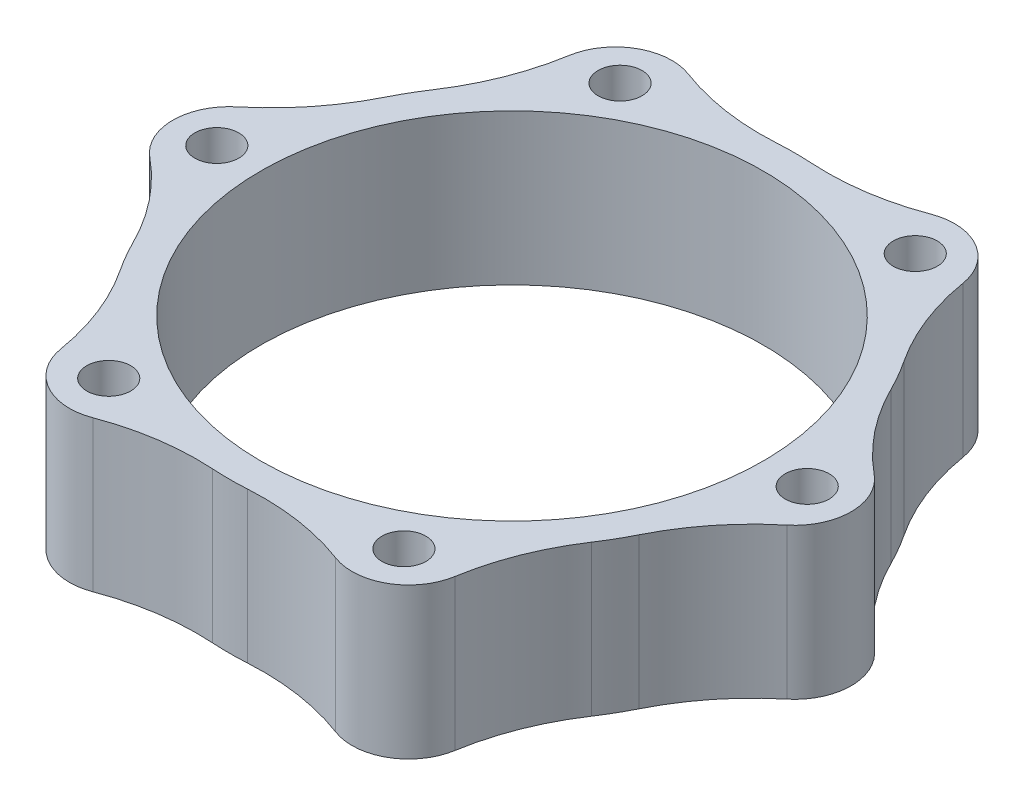
ISO-10303-21;
HEADER;
FILE_DESCRIPTION(('STEP AP214'),'2;1');
FILE_NAME('part.step','',(''),(''),'','','');
FILE_SCHEMA(('AUTOMOTIVE_DESIGN { 1 0 10303 214 1 1 1 1 }'));
ENDSEC;
DATA;
#1=APPLICATION_CONTEXT('core data for automotive mechanical design processes');
#2=APPLICATION_PROTOCOL_DEFINITION('international standard','automotive_design',2000,#1);
#3=PRODUCT_CONTEXT('',#1,'mechanical');
#4=PRODUCT('Part','Part','',(#3));
#5=PRODUCT_RELATED_PRODUCT_CATEGORY('part','',(#4));
#6=PRODUCT_DEFINITION_FORMATION('','',#4);
#7=PRODUCT_DEFINITION_CONTEXT('part definition',#1,'design');
#8=PRODUCT_DEFINITION('design','',#6,#7);
#9=PRODUCT_DEFINITION_SHAPE('','',#8);
#10=(LENGTH_UNIT() NAMED_UNIT(*) SI_UNIT(.MILLI.,.METRE.));
#11=(NAMED_UNIT(*) PLANE_ANGLE_UNIT() SI_UNIT($,.RADIAN.));
#12=(NAMED_UNIT(*) SI_UNIT($,.STERADIAN.) SOLID_ANGLE_UNIT());
#13=UNCERTAINTY_MEASURE_WITH_UNIT(LENGTH_MEASURE(1.E-05),#10,'distance_accuracy_value','');
#14=(GEOMETRIC_REPRESENTATION_CONTEXT(3) GLOBAL_UNCERTAINTY_ASSIGNED_CONTEXT((#13)) GLOBAL_UNIT_ASSIGNED_CONTEXT((#10,
#11,#12)) REPRESENTATION_CONTEXT('',''));
#15=CARTESIAN_POINT('',(0.,0.,0.));
#16=DIRECTION('',(0.,0.,1.));
#17=DIRECTION('',(1.,0.,0.));
#18=AXIS2_PLACEMENT_3D('',#15,#16,#17);
#19=CARTESIAN_POINT('',(0.,96.0623050896224,0.));
#20=DIRECTION('',(0.,-1.,0.));
#21=DIRECTION('',(0.,0.,-1.));
#22=AXIS2_PLACEMENT_3D('',#19,#20,#21);
#23=CYLINDRICAL_SURFACE('',#22,28.575);
#24=CARTESIAN_POINT('',(0.,0.,0.));
#25=DIRECTION('',(0.,1.,0.));
#26=DIRECTION('',(0.,0.,1.));
#27=AXIS2_PLACEMENT_3D('',#24,#25,#26);
#28=CIRCLE('',#27,28.575);
#29=CARTESIAN_POINT('',(1.76747627445477,0.,-28.5202849322941));
#30=VERTEX_POINT('',#29);
#31=CARTESIAN_POINT('',(-1.76747627445538,0.,-28.520284932294));
#32=VERTEX_POINT('',#31);
#33=EDGE_CURVE('E405',#30,#32,#28,.T.);
#34=ORIENTED_EDGE('',*,*,#33,.T.);
#35=DIRECTION('',(0.,-1.,0.));
#36=VECTOR('',#35,1.);
#37=CARTESIAN_POINT('',(-1.76747627445538,96.0623050896224,-28.520284932294));
#38=LINE('',#37,#36);
#39=CARTESIAN_POINT('',(-1.76747627445538,15.24,-28.520284932294));
#40=VERTEX_POINT('',#39);
#41=EDGE_CURVE('E308',#32,#40,#38,.F.);
#42=ORIENTED_EDGE('',*,*,#41,.T.);
#43=CARTESIAN_POINT('',(0.,15.24,0.));
#44=DIRECTION('',(0.,1.,0.));
#45=DIRECTION('',(0.,0.,1.));
#46=AXIS2_PLACEMENT_3D('',#43,#44,#45);
#47=CIRCLE('',#46,28.575);
#48=CARTESIAN_POINT('',(1.76747627445477,15.24,-28.5202849322941));
#49=VERTEX_POINT('',#48);
#50=EDGE_CURVE('E449',#49,#40,#47,.T.);
#51=ORIENTED_EDGE('',*,*,#50,.F.);
#52=DIRECTION('',(0.,-1.,0.));
#53=VECTOR('',#52,1.);
#54=CARTESIAN_POINT('',(1.76747627445477,96.0623050896224,-28.5202849322941));
#55=LINE('',#54,#53);
#56=EDGE_CURVE('E298',#49,#30,#55,.T.);
#57=ORIENTED_EDGE('',*,*,#56,.T.);
#58=EDGE_LOOP('',(#34,#42,#51,#57));
#59=FACE_BOUND('',#58,.T.);
#60=ADVANCED_FACE('F41',(#59),#23,.T.);
#61=CARTESIAN_POINT('',(25.5830294117647,0.,-12.7294631118827));
#62=VERTEX_POINT('',#61);
#63=CARTESIAN_POINT('',(23.8155531373095,0.,-15.7908218204116));
#64=VERTEX_POINT('',#63);
#65=EDGE_CURVE('E407',#62,#64,#28,.T.);
#66=ORIENTED_EDGE('',*,*,#65,.T.);
#67=DIRECTION('',(0.,-1.,0.));
#68=VECTOR('',#67,1.);
#69=CARTESIAN_POINT('',(23.8155531373095,96.0623050896224,-15.7908218204116));
#70=LINE('',#69,#68);
#71=CARTESIAN_POINT('',(23.8155531373095,15.24,-15.7908218204116));
#72=VERTEX_POINT('',#71);
#73=EDGE_CURVE('E290',#64,#72,#70,.F.);
#74=ORIENTED_EDGE('',*,*,#73,.T.);
#75=CARTESIAN_POINT('',(25.5830294117647,15.24,-12.7294631118827));
#76=VERTEX_POINT('',#75);
#77=EDGE_CURVE('E447',#76,#72,#47,.T.);
#78=ORIENTED_EDGE('',*,*,#77,.F.);
#79=DIRECTION('',(0.,-1.,0.));
#80=VECTOR('',#79,1.);
#81=CARTESIAN_POINT('',(25.5830294117647,96.0623050896224,-12.7294631118827));
#82=LINE('',#81,#80);
#83=EDGE_CURVE('E280',#76,#62,#82,.T.);
#84=ORIENTED_EDGE('',*,*,#83,.T.);
#85=EDGE_LOOP('',(#66,#74,#78,#84));
#86=FACE_BOUND('',#85,.T.);
#87=ADVANCED_FACE('F469',(#86),#23,.T.);
#88=CARTESIAN_POINT('',(23.8155531373097,0.,15.7908218204112));
#89=VERTEX_POINT('',#88);
#90=CARTESIAN_POINT('',(25.5830294117647,0.,12.7294631118827));
#91=VERTEX_POINT('',#90);
#92=EDGE_CURVE('E412',#89,#91,#28,.T.);
#93=ORIENTED_EDGE('',*,*,#92,.T.);
#94=DIRECTION('',(0.,-1.,0.));
#95=VECTOR('',#94,1.);
#96=CARTESIAN_POINT('',(25.5830294117647,96.0623050896224,12.7294631118827));
#97=LINE('',#96,#95);
#98=CARTESIAN_POINT('',(25.5830294117647,15.24,12.7294631118827));
#99=VERTEX_POINT('',#98);
#100=EDGE_CURVE('E272',#91,#99,#97,.F.);
#101=ORIENTED_EDGE('',*,*,#100,.T.);
#102=CARTESIAN_POINT('',(23.8155531373097,15.24,15.7908218204112));
#103=VERTEX_POINT('',#102);
#104=EDGE_CURVE('E445',#103,#99,#47,.T.);
#105=ORIENTED_EDGE('',*,*,#104,.F.);
#106=DIRECTION('',(0.,-1.,0.));
#107=VECTOR('',#106,1.);
#108=CARTESIAN_POINT('',(23.8155531373098,96.0623050896224,15.7908218204112));
#109=LINE('',#108,#107);
#110=EDGE_CURVE('E262',#103,#89,#109,.T.);
#111=ORIENTED_EDGE('',*,*,#110,.T.);
#112=EDGE_LOOP('',(#93,#101,#105,#111));
#113=FACE_BOUND('',#112,.T.);
#114=ADVANCED_FACE('F446',(#113),#23,.T.);
#115=CARTESIAN_POINT('',(-1.76747627445497,0.,28.520284932294));
#116=VERTEX_POINT('',#115);
#117=CARTESIAN_POINT('',(1.76747627445517,0.,28.520284932294));
#118=VERTEX_POINT('',#117);
#119=EDGE_CURVE('E225',#116,#118,#28,.T.);
#120=ORIENTED_EDGE('',*,*,#119,.T.);
#121=DIRECTION('',(0.,-1.,0.));
#122=VECTOR('',#121,1.);
#123=CARTESIAN_POINT('',(1.76747627445517,96.0623050896224,28.520284932294));
#124=LINE('',#123,#122);
#125=CARTESIAN_POINT('',(1.76747627445517,15.24,28.520284932294));
#126=VERTEX_POINT('',#125);
#127=EDGE_CURVE('E254',#118,#126,#124,.F.);
#128=ORIENTED_EDGE('',*,*,#127,.T.);
#129=CARTESIAN_POINT('',(-1.76747627445497,15.24,28.520284932294));
#130=VERTEX_POINT('',#129);
#131=EDGE_CURVE('E384',#130,#126,#47,.T.);
#132=ORIENTED_EDGE('',*,*,#131,.F.);
#133=DIRECTION('',(0.,-1.,0.));
#134=VECTOR('',#133,1.);
#135=CARTESIAN_POINT('',(-1.76747627445497,96.0623050896224,28.5202849322941));
#136=LINE('',#135,#134);
#137=EDGE_CURVE('E245',#130,#116,#136,.T.);
#138=ORIENTED_EDGE('',*,*,#137,.T.);
#139=EDGE_LOOP('',(#120,#128,#132,#138));
#140=FACE_BOUND('',#139,.T.);
#141=ADVANCED_FACE('F424',(#140),#23,.T.);
#142=CARTESIAN_POINT('',(-25.5830294117647,0.,12.7294631118827));
#143=VERTEX_POINT('',#142);
#144=CARTESIAN_POINT('',(-23.8155531373096,0.,15.7908218204114));
#145=VERTEX_POINT('',#144);
#146=EDGE_CURVE('E207',#143,#145,#28,.T.);
#147=ORIENTED_EDGE('',*,*,#146,.T.);
#148=DIRECTION('',(0.,-1.,0.));
#149=VECTOR('',#148,1.);
#150=CARTESIAN_POINT('',(-23.8155531373096,96.0623050896224,15.7908218204114));
#151=LINE('',#150,#149);
#152=CARTESIAN_POINT('',(-23.8155531373096,15.24,15.7908218204114));
#153=VERTEX_POINT('',#152);
#154=EDGE_CURVE('E232',#145,#153,#151,.F.);
#155=ORIENTED_EDGE('',*,*,#154,.T.);
#156=CARTESIAN_POINT('',(-25.5830294117647,15.24,12.7294631118827));
#157=VERTEX_POINT('',#156);
#158=EDGE_CURVE('E210',#157,#153,#47,.T.);
#159=ORIENTED_EDGE('',*,*,#158,.F.);
#160=DIRECTION('',(0.,-1.,0.));
#161=VECTOR('',#160,1.);
#162=CARTESIAN_POINT('',(-25.5830294117647,96.0623050896224,12.7294631118827));
#163=LINE('',#162,#161);
#164=EDGE_CURVE('E203',#157,#143,#163,.T.);
#165=ORIENTED_EDGE('',*,*,#164,.T.);
#166=EDGE_LOOP('',(#147,#155,#159,#165));
#167=FACE_BOUND('',#166,.T.);
#168=ADVANCED_FACE('F205',(#167),#23,.T.);
#169=CARTESIAN_POINT('',(-23.8155531373099,15.24,-15.7908218204111));
#170=VERTEX_POINT('',#169);
#171=CARTESIAN_POINT('',(-25.5830294117647,15.24,-12.7294631118827));
#172=VERTEX_POINT('',#171);
#173=EDGE_CURVE('E224',#170,#172,#47,.T.);
#174=ORIENTED_EDGE('',*,*,#173,.F.);
#175=DIRECTION('',(0.,-1.,0.));
#176=VECTOR('',#175,1.);
#177=CARTESIAN_POINT('',(-23.8155531373099,96.0623050896224,-15.7908218204111));
#178=LINE('',#177,#176);
#179=CARTESIAN_POINT('',(-23.8155531373099,0.,-15.7908218204111));
#180=VERTEX_POINT('',#179);
#181=EDGE_CURVE('E58',#170,#180,#178,.T.);
#182=ORIENTED_EDGE('',*,*,#181,.T.);
#183=CARTESIAN_POINT('',(-25.5830294117647,0.,-12.7294631118827));
#184=VERTEX_POINT('',#183);
#185=EDGE_CURVE('E227',#180,#184,#28,.T.);
#186=ORIENTED_EDGE('',*,*,#185,.T.);
#187=DIRECTION('',(0.,-1.,0.));
#188=VECTOR('',#187,1.);
#189=CARTESIAN_POINT('',(-25.5830294117647,96.0623050896224,-12.7294631118827));
#190=LINE('',#189,#188);
#191=EDGE_CURVE('E213',#184,#172,#190,.F.);
#192=ORIENTED_EDGE('',*,*,#191,.T.);
#193=EDGE_LOOP('',(#174,#182,#186,#192));
#194=FACE_BOUND('',#193,.T.);
#195=ADVANCED_FACE('F404',(#194),#23,.T.);
#196=CARTESIAN_POINT('',(0.,0.,0.));
#197=DIRECTION('',(0.,1.,0.));
#198=DIRECTION('',(0.,0.,1.));
#199=AXIS2_PLACEMENT_3D('',#196,#197,#198);
#200=PLANE('',#199);
#201=CARTESIAN_POINT('',(-14.9225000000003,0.,25.8465281759464));
#202=DIRECTION('',(0.,1.,0.));
#203=DIRECTION('',(0.866025403784433,0.,0.50000000000001));
#204=AXIS2_PLACEMENT_3D('',#201,#202,#203);
#205=CIRCLE('',#204,2.2225);
#206=CARTESIAN_POINT('',(-12.9977585400894,0.,26.9577781759464));
#207=VERTEX_POINT('',#206);
#208=EDGE_CURVE('E794',#207,#207,#205,.T.);
#209=ORIENTED_EDGE('',*,*,#208,.T.);
#210=EDGE_LOOP('',(#209));
#211=FACE_BOUND('',#210,.T.);
#212=CARTESIAN_POINT('',(14.9224999999998,0.,25.8465281759467));
#213=DIRECTION('',(0.,1.,0.));
#214=DIRECTION('',(0.866025403784443,0.,-0.499999999999992));
#215=AXIS2_PLACEMENT_3D('',#212,#213,#214);
#216=CIRCLE('',#215,2.2225);
#217=CARTESIAN_POINT('',(16.8472414599107,0.,24.7352781759467));
#218=VERTEX_POINT('',#217);
#219=EDGE_CURVE('E795',#218,#218,#216,.T.);
#220=ORIENTED_EDGE('',*,*,#219,.T.);
#221=EDGE_LOOP('',(#220));
#222=FACE_BOUND('',#221,.T.);
#223=CARTESIAN_POINT('',(29.845,0.,0.));
#224=DIRECTION('',(0.,1.,0.));
#225=DIRECTION('',(0.,0.,-1.));
#226=AXIS2_PLACEMENT_3D('',#223,#224,#225);
#227=CIRCLE('',#226,2.2225);
#228=CARTESIAN_POINT('',(29.845,0.,-2.2225));
#229=VERTEX_POINT('',#228);
#230=EDGE_CURVE('E797',#229,#229,#227,.T.);
#231=ORIENTED_EDGE('',*,*,#230,.T.);
#232=EDGE_LOOP('',(#231));
#233=FACE_BOUND('',#232,.T.);
#234=CARTESIAN_POINT('',(14.9225000000001,0.,-25.8465281759465));
#235=DIRECTION('',(0.,1.,0.));
#236=DIRECTION('',(-0.866025403784436,0.,-0.500000000000004));
#237=AXIS2_PLACEMENT_3D('',#234,#235,#236);
#238=CIRCLE('',#237,2.2225);
#239=CARTESIAN_POINT('',(12.9977585400892,0.,-26.9577781759465));
#240=VERTEX_POINT('',#239);
#241=EDGE_CURVE('E802',#240,#240,#238,.T.);
#242=ORIENTED_EDGE('',*,*,#241,.T.);
#243=EDGE_LOOP('',(#242));
#244=FACE_BOUND('',#243,.T.);
#245=CARTESIAN_POINT('',(-14.9224999999999,0.,-25.8465281759466));
#246=DIRECTION('',(0.,1.,0.));
#247=DIRECTION('',(-0.86602540378444,0.,0.499999999999998));
#248=AXIS2_PLACEMENT_3D('',#245,#246,#247);
#249=CIRCLE('',#248,2.2225);
#250=CARTESIAN_POINT('',(-16.8472414599109,0.,-24.7352781759466));
#251=VERTEX_POINT('',#250);
#252=EDGE_CURVE('E331',#251,#251,#249,.T.);
#253=ORIENTED_EDGE('',*,*,#252,.T.);
#254=EDGE_LOOP('',(#253));
#255=FACE_BOUND('',#254,.T.);
#256=CARTESIAN_POINT('',(-29.845,0.,0.));
#257=DIRECTION('',(0.,1.,0.));
#258=DIRECTION('',(0.,0.,1.));
#259=AXIS2_PLACEMENT_3D('',#256,#257,#258);
#260=CIRCLE('',#259,2.2225);
#261=CARTESIAN_POINT('',(-29.845,0.,2.2225));
#262=VERTEX_POINT('',#261);
#263=EDGE_CURVE('E326',#262,#262,#260,.T.);
#264=ORIENTED_EDGE('',*,*,#263,.T.);
#265=EDGE_LOOP('',(#264));
#266=FACE_BOUND('',#265,.T.);
#267=ORIENTED_EDGE('',*,*,#146,.F.);
#268=CARTESIAN_POINT('',(-48.3235,0.,24.0445414335562));
#269=DIRECTION('',(0.,1.,0.));
#270=DIRECTION('',(0.,0.,1.));
#271=AXIS2_PLACEMENT_3D('',#268,#269,#270);
#272=CIRCLE('',#271,25.4);
#273=CARTESIAN_POINT('',(-32.2022755102041,0.,4.41634434493889));
#274=VERTEX_POINT('',#273);
#275=EDGE_CURVE('E219',#143,#274,#272,.T.);
#276=ORIENTED_EDGE('',*,*,#275,.T.);
#277=CARTESIAN_POINT('',(-28.575,0.,0.));
#278=DIRECTION('',(0.,1.,0.));
#279=DIRECTION('',(0.,0.,1.));
#280=AXIS2_PLACEMENT_3D('',#277,#278,#279);
#281=CIRCLE('',#280,5.715);
#282=CARTESIAN_POINT('',(-32.2022755102041,0.,-4.41634434493888));
#283=VERTEX_POINT('',#282);
#284=EDGE_CURVE('E378',#274,#283,#281,.F.);
#285=ORIENTED_EDGE('',*,*,#284,.T.);
#286=CARTESIAN_POINT('',(-48.3235,0.,-24.0445414335562));
#287=DIRECTION('',(0.,1.,0.));
#288=DIRECTION('',(0.,0.,1.));
#289=AXIS2_PLACEMENT_3D('',#286,#287,#288);
#290=CIRCLE('',#289,25.4);
#291=EDGE_CURVE('E237',#283,#184,#290,.T.);
#292=ORIENTED_EDGE('',*,*,#291,.T.);
#293=ORIENTED_EDGE('',*,*,#185,.F.);
#294=CARTESIAN_POINT('',(-44.9849337038075,0.,-29.8271078829987));
#295=DIRECTION('',(0.,1.,0.));
#296=DIRECTION('',(0.,0.,1.));
#297=AXIS2_PLACEMENT_3D('',#294,#295,#296);
#298=CIRCLE('',#297,25.4);
#299=CARTESIAN_POINT('',(-19.9258041496792,0.,-25.6798164790325));
#300=VERTEX_POINT('',#299);
#301=EDGE_CURVE('E11',#180,#300,#298,.T.);
#302=ORIENTED_EDGE('',*,*,#301,.T.);
#303=CARTESIAN_POINT('',(-14.2875000000003,0.,-24.7466759131402));
#304=DIRECTION('',(0.,1.,0.));
#305=DIRECTION('',(0.,0.,1.));
#306=AXIS2_PLACEMENT_3D('',#303,#304,#305);
#307=CIRCLE('',#306,5.715);
#308=CARTESIAN_POINT('',(-12.2764713605256,0.,-30.0961608239715));
#309=VERTEX_POINT('',#308);
#310=EDGE_CURVE('E350',#300,#309,#307,.F.);
#311=ORIENTED_EDGE('',*,*,#310,.T.);
#312=CARTESIAN_POINT('',(-3.33856629619349,0.,-53.8716493165554));
#313=DIRECTION('',(0.,1.,0.));
#314=DIRECTION('',(0.,0.,1.));
#315=AXIS2_PLACEMENT_3D('',#312,#313,#314);
#316=CIRCLE('',#315,25.4);
#317=EDGE_CURVE('E319',#309,#32,#316,.T.);
#318=ORIENTED_EDGE('',*,*,#317,.T.);
#319=ORIENTED_EDGE('',*,*,#33,.F.);
#320=CARTESIAN_POINT('',(3.33856629619235,0.,-53.8716493165554));
#321=DIRECTION('',(0.,1.,0.));
#322=DIRECTION('',(0.,0.,1.));
#323=AXIS2_PLACEMENT_3D('',#320,#321,#322);
#324=CIRCLE('',#323,25.4);
#325=CARTESIAN_POINT('',(12.2764713605249,0.,-30.0961608239718));
#326=VERTEX_POINT('',#325);
#327=EDGE_CURVE('E306',#30,#326,#324,.T.);
#328=ORIENTED_EDGE('',*,*,#327,.T.);
#329=CARTESIAN_POINT('',(14.2874999999998,0.,-24.7466759131405));
#330=DIRECTION('',(0.,1.,0.));
#331=DIRECTION('',(0.,0.,1.));
#332=AXIS2_PLACEMENT_3D('',#329,#330,#331);
#333=CIRCLE('',#332,5.715);
#334=CARTESIAN_POINT('',(19.9258041496786,0.,-25.679816479033));
#335=VERTEX_POINT('',#334);
#336=EDGE_CURVE('E355',#326,#335,#333,.F.);
#337=ORIENTED_EDGE('',*,*,#336,.T.);
#338=CARTESIAN_POINT('',(44.9849337038069,0.,-29.8271078829997));
#339=DIRECTION('',(0.,1.,0.));
#340=DIRECTION('',(0.,0.,1.));
#341=AXIS2_PLACEMENT_3D('',#338,#339,#340);
#342=CIRCLE('',#341,25.4);
#343=EDGE_CURVE('E302',#335,#64,#342,.T.);
#344=ORIENTED_EDGE('',*,*,#343,.T.);
#345=ORIENTED_EDGE('',*,*,#65,.F.);
#346=CARTESIAN_POINT('',(48.3235,0.,-24.0445414335562));
#347=DIRECTION('',(0.,1.,0.));
#348=DIRECTION('',(0.,0.,1.));
#349=AXIS2_PLACEMENT_3D('',#346,#347,#348);
#350=CIRCLE('',#349,25.4);
#351=CARTESIAN_POINT('',(32.2022755102041,0.,-4.41634434493889));
#352=VERTEX_POINT('',#351);
#353=EDGE_CURVE('E288',#62,#352,#350,.T.);
#354=ORIENTED_EDGE('',*,*,#353,.T.);
#355=CARTESIAN_POINT('',(28.575,0.,0.));
#356=DIRECTION('',(0.,1.,0.));
#357=DIRECTION('',(0.,0.,1.));
#358=AXIS2_PLACEMENT_3D('',#355,#356,#357);
#359=CIRCLE('',#358,5.715);
#360=CARTESIAN_POINT('',(32.2022755102041,0.,4.41634434493888));
#361=VERTEX_POINT('',#360);
#362=EDGE_CURVE('E361',#352,#361,#359,.F.);
#363=ORIENTED_EDGE('',*,*,#362,.T.);
#364=CARTESIAN_POINT('',(48.3235,0.,24.0445414335562));
#365=DIRECTION('',(0.,1.,0.));
#366=DIRECTION('',(0.,0.,1.));
#367=AXIS2_PLACEMENT_3D('',#364,#365,#366);
#368=CIRCLE('',#367,25.4);
#369=EDGE_CURVE('E284',#361,#91,#368,.T.);
#370=ORIENTED_EDGE('',*,*,#369,.T.);
#371=ORIENTED_EDGE('',*,*,#92,.F.);
#372=CARTESIAN_POINT('',(44.9849337038073,0.,29.827107882999));
#373=DIRECTION('',(0.,1.,0.));
#374=DIRECTION('',(0.,0.,1.));
#375=AXIS2_PLACEMENT_3D('',#372,#373,#374);
#376=CIRCLE('',#375,25.4);
#377=CARTESIAN_POINT('',(19.925804149679,0.,25.6798164790327));
#378=VERTEX_POINT('',#377);
#379=EDGE_CURVE('E270',#89,#378,#376,.T.);
#380=ORIENTED_EDGE('',*,*,#379,.T.);
#381=CARTESIAN_POINT('',(14.2875000000001,0.,24.7466759131403));
#382=DIRECTION('',(0.,1.,0.));
#383=DIRECTION('',(0.,0.,1.));
#384=AXIS2_PLACEMENT_3D('',#381,#382,#383);
#385=CIRCLE('',#384,5.715);
#386=CARTESIAN_POINT('',(12.2764713605254,0.,30.0961608239716));
#387=VERTEX_POINT('',#386);
#388=EDGE_CURVE('E367',#378,#387,#385,.F.);
#389=ORIENTED_EDGE('',*,*,#388,.T.);
#390=CARTESIAN_POINT('',(3.33856629619311,0.,53.8716493165554));
#391=DIRECTION('',(0.,1.,0.));
#392=DIRECTION('',(0.,0.,1.));
#393=AXIS2_PLACEMENT_3D('',#390,#391,#392);
#394=CIRCLE('',#393,25.4);
#395=EDGE_CURVE('E266',#387,#118,#394,.T.);
#396=ORIENTED_EDGE('',*,*,#395,.T.);
#397=ORIENTED_EDGE('',*,*,#119,.F.);
#398=CARTESIAN_POINT('',(-3.33856629619272,0.,53.8716493165554));
#399=DIRECTION('',(0.,1.,0.));
#400=DIRECTION('',(0.,0.,1.));
#401=AXIS2_PLACEMENT_3D('',#398,#399,#400);
#402=CIRCLE('',#401,25.4);
#403=CARTESIAN_POINT('',(-12.2764713605251,0.,30.0961608239717));
#404=VERTEX_POINT('',#403);
#405=EDGE_CURVE('E252',#116,#404,#402,.T.);
#406=ORIENTED_EDGE('',*,*,#405,.T.);
#407=CARTESIAN_POINT('',(-14.2874999999999,0.,24.7466759131404));
#408=DIRECTION('',(0.,1.,0.));
#409=DIRECTION('',(0.,0.,1.));
#410=AXIS2_PLACEMENT_3D('',#407,#408,#409);
#411=CIRCLE('',#410,5.715);
#412=CARTESIAN_POINT('',(-19.9258041496788,0.,25.6798164790328));
#413=VERTEX_POINT('',#412);
#414=EDGE_CURVE('E373',#404,#413,#411,.F.);
#415=ORIENTED_EDGE('',*,*,#414,.T.);
#416=CARTESIAN_POINT('',(-44.9849337038071,0.,29.8271078829993));
#417=DIRECTION('',(0.,1.,0.));
#418=DIRECTION('',(0.,0.,1.));
#419=AXIS2_PLACEMENT_3D('',#416,#417,#418);
#420=CIRCLE('',#419,25.4);
#421=EDGE_CURVE('E223',#413,#145,#420,.T.);
#422=ORIENTED_EDGE('',*,*,#421,.T.);
#423=EDGE_LOOP('',(#267,#276,#285,#292,#293,#302,#311,#318,#319,#328,#337,#344,#345,#354,#363,
#370,#371,#380,#389,#396,#397,#406,#415,#422));
#424=FACE_BOUND('',#423,.T.);
#425=CARTESIAN_POINT('',(0.,0.,0.));
#426=DIRECTION('',(0.,1.,0.));
#427=DIRECTION('',(0.,0.,1.));
#428=AXIS2_PLACEMENT_3D('',#425,#426,#427);
#429=CIRCLE('',#428,25.4);
#430=CARTESIAN_POINT('',(0.,0.,25.4));
#431=VERTEX_POINT('',#430);
#432=EDGE_CURVE('E385',#431,#431,#429,.T.);
#433=ORIENTED_EDGE('',*,*,#432,.T.);
#434=EDGE_LOOP('',(#433));
#435=FACE_BOUND('',#434,.T.);
#436=ADVANCED_FACE('F216',(#211,#222,#233,#244,#255,#266,#424,#435),#200,.F.);
#437=CARTESIAN_POINT('',(0.,96.0623050896224,0.));
#438=DIRECTION('',(0.,-1.,0.));
#439=DIRECTION('',(0.,0.,-1.));
#440=AXIS2_PLACEMENT_3D('',#437,#438,#439);
#441=CYLINDRICAL_SURFACE('',#440,25.4);
#442=ORIENTED_EDGE('',*,*,#432,.F.);
#443=EDGE_LOOP('',(#442));
#444=FACE_BOUND('',#443,.T.);
#445=CARTESIAN_POINT('',(0.,15.24,0.));
#446=DIRECTION('',(0.,1.,0.));
#447=DIRECTION('',(0.,0.,1.));
#448=AXIS2_PLACEMENT_3D('',#445,#446,#447);
#449=CIRCLE('',#448,25.4);
#450=CARTESIAN_POINT('',(0.,15.24,25.4));
#451=VERTEX_POINT('',#450);
#452=EDGE_CURVE('E380',#451,#451,#449,.T.);
#453=ORIENTED_EDGE('',*,*,#452,.T.);
#454=EDGE_LOOP('',(#453));
#455=FACE_BOUND('',#454,.T.);
#456=ADVANCED_FACE('F464',(#444,#455),#441,.F.);
#457=CARTESIAN_POINT('',(0.,15.24,0.));
#458=DIRECTION('',(0.,1.,0.));
#459=DIRECTION('',(0.,0.,-1.));
#460=AXIS2_PLACEMENT_3D('',#457,#458,#459);
#461=PLANE('',#460);
#462=CARTESIAN_POINT('',(-14.9225000000003,15.24,25.8465281759464));
#463=DIRECTION('',(0.,1.,0.));
#464=DIRECTION('',(0.,0.,1.));
#465=AXIS2_PLACEMENT_3D('',#462,#463,#464);
#466=CIRCLE('',#465,2.2225);
#467=CARTESIAN_POINT('',(-14.9225000000003,15.24,28.0690281759464));
#468=VERTEX_POINT('',#467);
#469=EDGE_CURVE('E45',#468,#468,#466,.T.);
#470=ORIENTED_EDGE('',*,*,#469,.F.);
#471=EDGE_LOOP('',(#470));
#472=FACE_BOUND('',#471,.T.);
#473=CARTESIAN_POINT('',(14.9224999999998,15.24,25.8465281759467));
#474=DIRECTION('',(0.,1.,0.));
#475=DIRECTION('',(0.,0.,1.));
#476=AXIS2_PLACEMENT_3D('',#473,#474,#475);
#477=CIRCLE('',#476,2.2225);
#478=CARTESIAN_POINT('',(14.9224999999998,15.24,28.0690281759467));
#479=VERTEX_POINT('',#478);
#480=EDGE_CURVE('E336',#479,#479,#477,.T.);
#481=ORIENTED_EDGE('',*,*,#480,.F.);
#482=EDGE_LOOP('',(#481));
#483=FACE_BOUND('',#482,.T.);
#484=CARTESIAN_POINT('',(29.845,15.24,0.));
#485=DIRECTION('',(0.,1.,0.));
#486=DIRECTION('',(0.,0.,1.));
#487=AXIS2_PLACEMENT_3D('',#484,#485,#486);
#488=CIRCLE('',#487,2.2225);
#489=CARTESIAN_POINT('',(29.845,15.24,2.2225));
#490=VERTEX_POINT('',#489);
#491=EDGE_CURVE('E334',#490,#490,#488,.T.);
#492=ORIENTED_EDGE('',*,*,#491,.F.);
#493=EDGE_LOOP('',(#492));
#494=FACE_BOUND('',#493,.T.);
#495=CARTESIAN_POINT('',(14.9225000000001,15.24,-25.8465281759465));
#496=DIRECTION('',(0.,1.,0.));
#497=DIRECTION('',(0.,0.,1.));
#498=AXIS2_PLACEMENT_3D('',#495,#496,#497);
#499=CIRCLE('',#498,2.2225);
#500=CARTESIAN_POINT('',(14.9225000000001,15.24,-23.6240281759465));
#501=VERTEX_POINT('',#500);
#502=EDGE_CURVE('E330',#501,#501,#499,.T.);
#503=ORIENTED_EDGE('',*,*,#502,.F.);
#504=EDGE_LOOP('',(#503));
#505=FACE_BOUND('',#504,.T.);
#506=CARTESIAN_POINT('',(-14.9224999999999,15.24,-25.8465281759466));
#507=DIRECTION('',(0.,1.,0.));
#508=DIRECTION('',(0.,0.,1.));
#509=AXIS2_PLACEMENT_3D('',#506,#507,#508);
#510=CIRCLE('',#509,2.2225);
#511=CARTESIAN_POINT('',(-14.9224999999999,15.24,-23.6240281759466));
#512=VERTEX_POINT('',#511);
#513=EDGE_CURVE('E327',#512,#512,#510,.T.);
#514=ORIENTED_EDGE('',*,*,#513,.F.);
#515=EDGE_LOOP('',(#514));
#516=FACE_BOUND('',#515,.T.);
#517=CARTESIAN_POINT('',(-29.845,15.24,0.));
#518=DIRECTION('',(0.,1.,0.));
#519=DIRECTION('',(0.,0.,1.));
#520=AXIS2_PLACEMENT_3D('',#517,#518,#519);
#521=CIRCLE('',#520,2.2225);
#522=CARTESIAN_POINT('',(-29.845,15.24,2.2225));
#523=VERTEX_POINT('',#522);
#524=EDGE_CURVE('E322',#523,#523,#521,.T.);
#525=ORIENTED_EDGE('',*,*,#524,.F.);
#526=EDGE_LOOP('',(#525));
#527=FACE_BOUND('',#526,.T.);
#528=ORIENTED_EDGE('',*,*,#452,.F.);
#529=EDGE_LOOP('',(#528));
#530=FACE_BOUND('',#529,.T.);
#531=CARTESIAN_POINT('',(-28.575,15.24,0.));
#532=DIRECTION('',(0.,1.,0.));
#533=DIRECTION('',(0.,0.,1.));
#534=AXIS2_PLACEMENT_3D('',#531,#532,#533);
#535=CIRCLE('',#534,5.715);
#536=CARTESIAN_POINT('',(-32.2022755102041,15.24,-4.41634434493888));
#537=VERTEX_POINT('',#536);
#538=CARTESIAN_POINT('',(-32.2022755102041,15.24,4.41634434493889));
#539=VERTEX_POINT('',#538);
#540=EDGE_CURVE('E375',#537,#539,#535,.T.);
#541=ORIENTED_EDGE('',*,*,#540,.T.);
#542=CARTESIAN_POINT('',(-48.3235,15.24,24.0445414335562));
#543=DIRECTION('',(0.,1.,0.));
#544=DIRECTION('',(0.,0.,1.));
#545=AXIS2_PLACEMENT_3D('',#542,#543,#544);
#546=CIRCLE('',#545,25.4);
#547=EDGE_CURVE('E233',#539,#157,#546,.F.);
#548=ORIENTED_EDGE('',*,*,#547,.T.);
#549=ORIENTED_EDGE('',*,*,#158,.T.);
#550=CARTESIAN_POINT('',(-44.9849337038071,15.24,29.8271078829993));
#551=DIRECTION('',(0.,1.,0.));
#552=DIRECTION('',(0.,0.,1.));
#553=AXIS2_PLACEMENT_3D('',#550,#551,#552);
#554=CIRCLE('',#553,25.4);
#555=CARTESIAN_POINT('',(-19.9258041496788,15.24,25.6798164790328));
#556=VERTEX_POINT('',#555);
#557=EDGE_CURVE('E247',#153,#556,#554,.F.);
#558=ORIENTED_EDGE('',*,*,#557,.T.);
#559=CARTESIAN_POINT('',(-14.2874999999999,15.24,24.7466759131404));
#560=DIRECTION('',(0.,1.,0.));
#561=DIRECTION('',(0.86602540378444,0.,0.499999999999998));
#562=AXIS2_PLACEMENT_3D('',#559,#560,#561);
#563=CIRCLE('',#562,5.715);
#564=CARTESIAN_POINT('',(-12.2764713605251,15.24,30.0961608239717));
#565=VERTEX_POINT('',#564);
#566=EDGE_CURVE('E370',#556,#565,#563,.T.);
#567=ORIENTED_EDGE('',*,*,#566,.T.);
#568=CARTESIAN_POINT('',(-3.33856629619272,15.24,53.8716493165554));
#569=DIRECTION('',(0.,1.,0.));
#570=DIRECTION('',(0.,0.,1.));
#571=AXIS2_PLACEMENT_3D('',#568,#569,#570);
#572=CIRCLE('',#571,25.4);
#573=EDGE_CURVE('E250',#565,#130,#572,.F.);
#574=ORIENTED_EDGE('',*,*,#573,.T.);
#575=ORIENTED_EDGE('',*,*,#131,.T.);
#576=CARTESIAN_POINT('',(3.33856629619311,15.24,53.8716493165554));
#577=DIRECTION('',(0.,1.,0.));
#578=DIRECTION('',(0.,0.,1.));
#579=AXIS2_PLACEMENT_3D('',#576,#577,#578);
#580=CIRCLE('',#579,25.4);
#581=CARTESIAN_POINT('',(12.2764713605254,15.24,30.0961608239716));
#582=VERTEX_POINT('',#581);
#583=EDGE_CURVE('E264',#126,#582,#580,.F.);
#584=ORIENTED_EDGE('',*,*,#583,.T.);
#585=CARTESIAN_POINT('',(14.2875000000001,15.24,24.7466759131403));
#586=DIRECTION('',(0.,1.,0.));
#587=DIRECTION('',(0.866025403784436,0.,-0.500000000000004));
#588=AXIS2_PLACEMENT_3D('',#585,#586,#587);
#589=CIRCLE('',#588,5.715);
#590=CARTESIAN_POINT('',(19.925804149679,15.24,25.6798164790327));
#591=VERTEX_POINT('',#590);
#592=EDGE_CURVE('E364',#582,#591,#589,.T.);
#593=ORIENTED_EDGE('',*,*,#592,.T.);
#594=CARTESIAN_POINT('',(44.9849337038073,15.24,29.827107882999));
#595=DIRECTION('',(0.,1.,0.));
#596=DIRECTION('',(0.,0.,1.));
#597=AXIS2_PLACEMENT_3D('',#594,#595,#596);
#598=CIRCLE('',#597,25.4);
#599=EDGE_CURVE('E268',#591,#103,#598,.F.);
#600=ORIENTED_EDGE('',*,*,#599,.T.);
#601=ORIENTED_EDGE('',*,*,#104,.T.);
#602=CARTESIAN_POINT('',(48.3235,15.24,24.0445414335562));
#603=DIRECTION('',(0.,1.,0.));
#604=DIRECTION('',(0.,0.,1.));
#605=AXIS2_PLACEMENT_3D('',#602,#603,#604);
#606=CIRCLE('',#605,25.4);
#607=CARTESIAN_POINT('',(32.2022755102041,15.24,4.41634434493888));
#608=VERTEX_POINT('',#607);
#609=EDGE_CURVE('E282',#99,#608,#606,.F.);
#610=ORIENTED_EDGE('',*,*,#609,.T.);
#611=CARTESIAN_POINT('',(28.575,15.24,0.));
#612=DIRECTION('',(0.,1.,0.));
#613=DIRECTION('',(0.,0.,-1.));
#614=AXIS2_PLACEMENT_3D('',#611,#612,#613);
#615=CIRCLE('',#614,5.715);
#616=CARTESIAN_POINT('',(32.2022755102041,15.24,-4.41634434493889));
#617=VERTEX_POINT('',#616);
#618=EDGE_CURVE('E358',#608,#617,#615,.T.);
#619=ORIENTED_EDGE('',*,*,#618,.T.);
#620=CARTESIAN_POINT('',(48.3235,15.24,-24.0445414335562));
#621=DIRECTION('',(0.,1.,0.));
#622=DIRECTION('',(0.,0.,1.));
#623=AXIS2_PLACEMENT_3D('',#620,#621,#622);
#624=CIRCLE('',#623,25.4);
#625=EDGE_CURVE('E286',#617,#76,#624,.F.);
#626=ORIENTED_EDGE('',*,*,#625,.T.);
#627=ORIENTED_EDGE('',*,*,#77,.T.);
#628=CARTESIAN_POINT('',(44.9849337038069,15.24,-29.8271078829997));
#629=DIRECTION('',(0.,1.,0.));
#630=DIRECTION('',(0.,0.,1.));
#631=AXIS2_PLACEMENT_3D('',#628,#629,#630);
#632=CIRCLE('',#631,25.4);
#633=CARTESIAN_POINT('',(19.9258041496786,15.24,-25.679816479033));
#634=VERTEX_POINT('',#633);
#635=EDGE_CURVE('E300',#72,#634,#632,.F.);
#636=ORIENTED_EDGE('',*,*,#635,.T.);
#637=CARTESIAN_POINT('',(14.2874999999998,15.24,-24.7466759131405));
#638=DIRECTION('',(0.,1.,0.));
#639=DIRECTION('',(-0.866025403784443,0.,-0.499999999999992));
#640=AXIS2_PLACEMENT_3D('',#637,#638,#639);
#641=CIRCLE('',#640,5.715);
#642=CARTESIAN_POINT('',(12.2764713605249,15.24,-30.0961608239718));
#643=VERTEX_POINT('',#642);
#644=EDGE_CURVE('E353',#634,#643,#641,.T.);
#645=ORIENTED_EDGE('',*,*,#644,.T.);
#646=CARTESIAN_POINT('',(3.33856629619235,15.24,-53.8716493165554));
#647=DIRECTION('',(0.,1.,0.));
#648=DIRECTION('',(0.,0.,1.));
#649=AXIS2_PLACEMENT_3D('',#646,#647,#648);
#650=CIRCLE('',#649,25.4);
#651=EDGE_CURVE('E304',#643,#49,#650,.F.);
#652=ORIENTED_EDGE('',*,*,#651,.T.);
#653=ORIENTED_EDGE('',*,*,#50,.T.);
#654=CARTESIAN_POINT('',(-3.33856629619349,15.24,-53.8716493165554));
#655=DIRECTION('',(0.,1.,0.));
#656=DIRECTION('',(0.,0.,1.));
#657=AXIS2_PLACEMENT_3D('',#654,#655,#656);
#658=CIRCLE('',#657,25.4);
#659=CARTESIAN_POINT('',(-12.2764713605256,15.24,-30.0961608239715));
#660=VERTEX_POINT('',#659);
#661=EDGE_CURVE('E317',#40,#660,#658,.F.);
#662=ORIENTED_EDGE('',*,*,#661,.T.);
#663=CARTESIAN_POINT('',(-14.2875000000003,15.24,-24.7466759131402));
#664=DIRECTION('',(0.,1.,0.));
#665=DIRECTION('',(-0.866025403784433,0.,0.50000000000001));
#666=AXIS2_PLACEMENT_3D('',#663,#664,#665);
#667=CIRCLE('',#666,5.715);
#668=CARTESIAN_POINT('',(-19.9258041496792,15.24,-25.6798164790325));
#669=VERTEX_POINT('',#668);
#670=EDGE_CURVE('E325',#660,#669,#667,.T.);
#671=ORIENTED_EDGE('',*,*,#670,.T.);
#672=CARTESIAN_POINT('',(-44.9849337038075,15.24,-29.8271078829987));
#673=DIRECTION('',(0.,1.,0.));
#674=DIRECTION('',(0.,0.,1.));
#675=AXIS2_PLACEMENT_3D('',#672,#673,#674);
#676=CIRCLE('',#675,25.4);
#677=EDGE_CURVE('E50',#669,#170,#676,.F.);
#678=ORIENTED_EDGE('',*,*,#677,.T.);
#679=ORIENTED_EDGE('',*,*,#173,.T.);
#680=CARTESIAN_POINT('',(-48.3235,15.24,-24.0445414335562));
#681=DIRECTION('',(0.,1.,0.));
#682=DIRECTION('',(0.,0.,1.));
#683=AXIS2_PLACEMENT_3D('',#680,#681,#682);
#684=CIRCLE('',#683,25.4);
#685=EDGE_CURVE('E395',#172,#537,#684,.F.);
#686=ORIENTED_EDGE('',*,*,#685,.T.);
#687=EDGE_LOOP('',(#541,#548,#549,#558,#567,#574,#575,#584,#593,#600,#601,#610,#619,#626,#627,
#636,#645,#652,#653,#662,#671,#678,#679,#686));
#688=FACE_BOUND('',#687,.T.);
#689=ADVANCED_FACE('F434',(#472,#483,#494,#505,#516,#527,#530,#688),#461,.T.);
#690=CARTESIAN_POINT('',(-28.575,-13.0447300566167,0.));
#691=DIRECTION('',(0.,1.,0.));
#692=DIRECTION('',(0.,0.,1.));
#693=AXIS2_PLACEMENT_3D('',#690,#691,#692);
#694=CYLINDRICAL_SURFACE('',#693,5.715);
#695=ORIENTED_EDGE('',*,*,#540,.F.);
#696=DIRECTION('',(0.,1.,0.));
#697=VECTOR('',#696,1.);
#698=CARTESIAN_POINT('',(-32.2022755102041,-13.0447300566167,-4.41634434493888));
#699=LINE('',#698,#697);
#700=EDGE_CURVE('E393',#537,#283,#699,.F.);
#701=ORIENTED_EDGE('',*,*,#700,.T.);
#702=ORIENTED_EDGE('',*,*,#284,.F.);
#703=DIRECTION('',(0.,1.,0.));
#704=VECTOR('',#703,1.);
#705=CARTESIAN_POINT('',(-32.2022755102041,-13.0447300566167,4.41634434493889));
#706=LINE('',#705,#704);
#707=EDGE_CURVE('E231',#274,#539,#706,.T.);
#708=ORIENTED_EDGE('',*,*,#707,.T.);
#709=EDGE_LOOP('',(#695,#701,#702,#708));
#710=FACE_BOUND('',#709,.T.);
#711=ADVANCED_FACE('F455',(#710),#694,.T.);
#712=CARTESIAN_POINT('',(-48.3235,-13.0447300566167,-24.0445414335562));
#713=DIRECTION('',(0.,-1.,0.));
#714=DIRECTION('',(0.,0.,-1.));
#715=AXIS2_PLACEMENT_3D('',#712,#713,#714);
#716=CYLINDRICAL_SURFACE('',#715,25.4);
#717=ORIENTED_EDGE('',*,*,#291,.F.);
#718=ORIENTED_EDGE('',*,*,#700,.F.);
#719=ORIENTED_EDGE('',*,*,#685,.F.);
#720=ORIENTED_EDGE('',*,*,#191,.F.);
#721=EDGE_LOOP('',(#717,#718,#719,#720));
#722=FACE_BOUND('',#721,.T.);
#723=ADVANCED_FACE('F403',(#722),#716,.F.);
#724=CARTESIAN_POINT('',(-48.3235,96.0623050896224,24.0445414335562));
#725=DIRECTION('',(0.,-1.,0.));
#726=DIRECTION('',(0.,0.,-1.));
#727=AXIS2_PLACEMENT_3D('',#724,#725,#726);
#728=CYLINDRICAL_SURFACE('',#727,25.4);
#729=ORIENTED_EDGE('',*,*,#275,.F.);
#730=ORIENTED_EDGE('',*,*,#164,.F.);
#731=ORIENTED_EDGE('',*,*,#547,.F.);
#732=ORIENTED_EDGE('',*,*,#707,.F.);
#733=EDGE_LOOP('',(#729,#730,#731,#732));
#734=FACE_BOUND('',#733,.T.);
#735=ADVANCED_FACE('F229',(#734),#728,.F.);
#736=CARTESIAN_POINT('',(-14.2874999999999,-14.1887443313552,24.7466759131404));
#737=DIRECTION('',(0.,1.,0.));
#738=DIRECTION('',(0.,0.,1.));
#739=AXIS2_PLACEMENT_3D('',#736,#737,#738);
#740=CYLINDRICAL_SURFACE('',#739,5.715);
#741=ORIENTED_EDGE('',*,*,#566,.F.);
#742=DIRECTION('',(0.,1.,0.));
#743=VECTOR('',#742,1.);
#744=CARTESIAN_POINT('',(-19.9258041496788,-14.1887443313552,25.6798164790328));
#745=LINE('',#744,#743);
#746=EDGE_CURVE('E243',#556,#413,#745,.F.);
#747=ORIENTED_EDGE('',*,*,#746,.T.);
#748=ORIENTED_EDGE('',*,*,#414,.F.);
#749=DIRECTION('',(0.,1.,0.));
#750=VECTOR('',#749,1.);
#751=CARTESIAN_POINT('',(-12.2764713605251,-14.1887443313552,30.0961608239717));
#752=LINE('',#751,#750);
#753=EDGE_CURVE('E235',#404,#565,#752,.T.);
#754=ORIENTED_EDGE('',*,*,#753,.T.);
#755=EDGE_LOOP('',(#741,#747,#748,#754));
#756=FACE_BOUND('',#755,.T.);
#757=ADVANCED_FACE('F505',(#756),#740,.T.);
#758=CARTESIAN_POINT('',(14.2875000000001,-14.1887443313552,24.7466759131403));
#759=DIRECTION('',(0.,1.,0.));
#760=DIRECTION('',(0.,0.,1.));
#761=AXIS2_PLACEMENT_3D('',#758,#759,#760);
#762=CYLINDRICAL_SURFACE('',#761,5.715);
#763=ORIENTED_EDGE('',*,*,#592,.F.);
#764=DIRECTION('',(0.,1.,0.));
#765=VECTOR('',#764,1.);
#766=CARTESIAN_POINT('',(12.2764713605254,-14.1887443313552,30.0961608239716));
#767=LINE('',#766,#765);
#768=EDGE_CURVE('E260',#582,#387,#767,.F.);
#769=ORIENTED_EDGE('',*,*,#768,.T.);
#770=ORIENTED_EDGE('',*,*,#388,.F.);
#771=DIRECTION('',(0.,1.,0.));
#772=VECTOR('',#771,1.);
#773=CARTESIAN_POINT('',(19.925804149679,-14.1887443313552,25.6798164790327));
#774=LINE('',#773,#772);
#775=EDGE_CURVE('E257',#378,#591,#774,.T.);
#776=ORIENTED_EDGE('',*,*,#775,.T.);
#777=EDGE_LOOP('',(#763,#769,#770,#776));
#778=FACE_BOUND('',#777,.T.);
#779=ADVANCED_FACE('F436',(#778),#762,.T.);
#780=CARTESIAN_POINT('',(28.575,-13.0447300566167,0.));
#781=DIRECTION('',(0.,1.,0.));
#782=DIRECTION('',(0.,0.,1.));
#783=AXIS2_PLACEMENT_3D('',#780,#781,#782);
#784=CYLINDRICAL_SURFACE('',#783,5.715);
#785=ORIENTED_EDGE('',*,*,#618,.F.);
#786=DIRECTION('',(0.,1.,0.));
#787=VECTOR('',#786,1.);
#788=CARTESIAN_POINT('',(32.2022755102041,-13.0447300566167,4.41634434493888));
#789=LINE('',#788,#787);
#790=EDGE_CURVE('E278',#608,#361,#789,.F.);
#791=ORIENTED_EDGE('',*,*,#790,.T.);
#792=ORIENTED_EDGE('',*,*,#362,.F.);
#793=DIRECTION('',(0.,1.,0.));
#794=VECTOR('',#793,1.);
#795=CARTESIAN_POINT('',(32.2022755102041,-13.0447300566167,-4.41634434493889));
#796=LINE('',#795,#794);
#797=EDGE_CURVE('E275',#352,#617,#796,.T.);
#798=ORIENTED_EDGE('',*,*,#797,.T.);
#799=EDGE_LOOP('',(#785,#791,#792,#798));
#800=FACE_BOUND('',#799,.T.);
#801=ADVANCED_FACE('F517',(#800),#784,.T.);
#802=CARTESIAN_POINT('',(14.2874999999998,-14.1887443313552,-24.7466759131405));
#803=DIRECTION('',(0.,1.,0.));
#804=DIRECTION('',(0.,0.,1.));
#805=AXIS2_PLACEMENT_3D('',#802,#803,#804);
#806=CYLINDRICAL_SURFACE('',#805,5.715);
#807=ORIENTED_EDGE('',*,*,#644,.F.);
#808=DIRECTION('',(0.,1.,0.));
#809=VECTOR('',#808,1.);
#810=CARTESIAN_POINT('',(19.9258041496786,-14.1887443313552,-25.679816479033));
#811=LINE('',#810,#809);
#812=EDGE_CURVE('E296',#634,#335,#811,.F.);
#813=ORIENTED_EDGE('',*,*,#812,.T.);
#814=ORIENTED_EDGE('',*,*,#336,.F.);
#815=DIRECTION('',(0.,1.,0.));
#816=VECTOR('',#815,1.);
#817=CARTESIAN_POINT('',(12.2764713605249,-14.1887443313552,-30.0961608239718));
#818=LINE('',#817,#816);
#819=EDGE_CURVE('E293',#326,#643,#818,.T.);
#820=ORIENTED_EDGE('',*,*,#819,.T.);
#821=EDGE_LOOP('',(#807,#813,#814,#820));
#822=FACE_BOUND('',#821,.T.);
#823=ADVANCED_FACE('F525',(#822),#806,.T.);
#824=CARTESIAN_POINT('',(-14.2875000000003,-14.1887443313552,-24.7466759131402));
#825=DIRECTION('',(0.,1.,0.));
#826=DIRECTION('',(0.,0.,1.));
#827=AXIS2_PLACEMENT_3D('',#824,#825,#826);
#828=CYLINDRICAL_SURFACE('',#827,5.715);
#829=ORIENTED_EDGE('',*,*,#670,.F.);
#830=DIRECTION('',(0.,1.,0.));
#831=VECTOR('',#830,1.);
#832=CARTESIAN_POINT('',(-12.2764713605256,-14.1887443313552,-30.0961608239715));
#833=LINE('',#832,#831);
#834=EDGE_CURVE('E314',#660,#309,#833,.F.);
#835=ORIENTED_EDGE('',*,*,#834,.T.);
#836=ORIENTED_EDGE('',*,*,#310,.F.);
#837=DIRECTION('',(0.,1.,0.));
#838=VECTOR('',#837,1.);
#839=CARTESIAN_POINT('',(-19.9258041496792,-14.1887443313552,-25.6798164790325));
#840=LINE('',#839,#838);
#841=EDGE_CURVE('E311',#300,#669,#840,.T.);
#842=ORIENTED_EDGE('',*,*,#841,.T.);
#843=EDGE_LOOP('',(#829,#835,#836,#842));
#844=FACE_BOUND('',#843,.T.);
#845=ADVANCED_FACE('F534',(#844),#828,.T.);
#846=CARTESIAN_POINT('',(-44.9849337038071,-14.1887443313552,29.8271078829993));
#847=DIRECTION('',(0.,-1.,0.));
#848=DIRECTION('',(0.,0.,-1.));
#849=AXIS2_PLACEMENT_3D('',#846,#847,#848);
#850=CYLINDRICAL_SURFACE('',#849,25.4);
#851=ORIENTED_EDGE('',*,*,#421,.F.);
#852=ORIENTED_EDGE('',*,*,#746,.F.);
#853=ORIENTED_EDGE('',*,*,#557,.F.);
#854=ORIENTED_EDGE('',*,*,#154,.F.);
#855=EDGE_LOOP('',(#851,#852,#853,#854));
#856=FACE_BOUND('',#855,.T.);
#857=ADVANCED_FACE('F543',(#856),#850,.F.);
#858=CARTESIAN_POINT('',(-3.33856629619272,96.0623050896224,53.8716493165554));
#859=DIRECTION('',(0.,-1.,0.));
#860=DIRECTION('',(0.,0.,-1.));
#861=AXIS2_PLACEMENT_3D('',#858,#859,#860);
#862=CYLINDRICAL_SURFACE('',#861,25.4);
#863=ORIENTED_EDGE('',*,*,#405,.F.);
#864=ORIENTED_EDGE('',*,*,#137,.F.);
#865=ORIENTED_EDGE('',*,*,#573,.F.);
#866=ORIENTED_EDGE('',*,*,#753,.F.);
#867=EDGE_LOOP('',(#863,#864,#865,#866));
#868=FACE_BOUND('',#867,.T.);
#869=ADVANCED_FACE('F552',(#868),#862,.F.);
#870=CARTESIAN_POINT('',(3.33856629619311,-14.1887443313552,53.8716493165554));
#871=DIRECTION('',(0.,-1.,0.));
#872=DIRECTION('',(0.,0.,-1.));
#873=AXIS2_PLACEMENT_3D('',#870,#871,#872);
#874=CYLINDRICAL_SURFACE('',#873,25.4);
#875=ORIENTED_EDGE('',*,*,#395,.F.);
#876=ORIENTED_EDGE('',*,*,#768,.F.);
#877=ORIENTED_EDGE('',*,*,#583,.F.);
#878=ORIENTED_EDGE('',*,*,#127,.F.);
#879=EDGE_LOOP('',(#875,#876,#877,#878));
#880=FACE_BOUND('',#879,.T.);
#881=ADVANCED_FACE('F431',(#880),#874,.F.);
#882=CARTESIAN_POINT('',(44.9849337038073,96.0623050896224,29.827107882999));
#883=DIRECTION('',(0.,-1.,0.));
#884=DIRECTION('',(0.,0.,-1.));
#885=AXIS2_PLACEMENT_3D('',#882,#883,#884);
#886=CYLINDRICAL_SURFACE('',#885,25.4);
#887=ORIENTED_EDGE('',*,*,#379,.F.);
#888=ORIENTED_EDGE('',*,*,#110,.F.);
#889=ORIENTED_EDGE('',*,*,#599,.F.);
#890=ORIENTED_EDGE('',*,*,#775,.F.);
#891=EDGE_LOOP('',(#887,#888,#889,#890));
#892=FACE_BOUND('',#891,.T.);
#893=ADVANCED_FACE('F441',(#892),#886,.F.);
#894=CARTESIAN_POINT('',(48.3235,-13.0447300566167,24.0445414335562));
#895=DIRECTION('',(0.,-1.,0.));
#896=DIRECTION('',(0.,0.,-1.));
#897=AXIS2_PLACEMENT_3D('',#894,#895,#896);
#898=CYLINDRICAL_SURFACE('',#897,25.4);
#899=ORIENTED_EDGE('',*,*,#369,.F.);
#900=ORIENTED_EDGE('',*,*,#790,.F.);
#901=ORIENTED_EDGE('',*,*,#609,.F.);
#902=ORIENTED_EDGE('',*,*,#100,.F.);
#903=EDGE_LOOP('',(#899,#900,#901,#902));
#904=FACE_BOUND('',#903,.T.);
#905=ADVANCED_FACE('F576',(#904),#898,.F.);
#906=CARTESIAN_POINT('',(48.3235,96.0623050896224,-24.0445414335562));
#907=DIRECTION('',(0.,-1.,0.));
#908=DIRECTION('',(0.,0.,-1.));
#909=AXIS2_PLACEMENT_3D('',#906,#907,#908);
#910=CYLINDRICAL_SURFACE('',#909,25.4);
#911=ORIENTED_EDGE('',*,*,#353,.F.);
#912=ORIENTED_EDGE('',*,*,#83,.F.);
#913=ORIENTED_EDGE('',*,*,#625,.F.);
#914=ORIENTED_EDGE('',*,*,#797,.F.);
#915=EDGE_LOOP('',(#911,#912,#913,#914));
#916=FACE_BOUND('',#915,.T.);
#917=ADVANCED_FACE('F584',(#916),#910,.F.);
#918=CARTESIAN_POINT('',(44.9849337038069,-14.1887443313552,-29.8271078829997));
#919=DIRECTION('',(0.,-1.,0.));
#920=DIRECTION('',(0.,0.,-1.));
#921=AXIS2_PLACEMENT_3D('',#918,#919,#920);
#922=CYLINDRICAL_SURFACE('',#921,25.4);
#923=ORIENTED_EDGE('',*,*,#343,.F.);
#924=ORIENTED_EDGE('',*,*,#812,.F.);
#925=ORIENTED_EDGE('',*,*,#635,.F.);
#926=ORIENTED_EDGE('',*,*,#73,.F.);
#927=EDGE_LOOP('',(#923,#924,#925,#926));
#928=FACE_BOUND('',#927,.T.);
#929=ADVANCED_FACE('F593',(#928),#922,.F.);
#930=CARTESIAN_POINT('',(3.33856629619235,96.0623050896224,-53.8716493165554));
#931=DIRECTION('',(0.,-1.,0.));
#932=DIRECTION('',(0.,0.,-1.));
#933=AXIS2_PLACEMENT_3D('',#930,#931,#932);
#934=CYLINDRICAL_SURFACE('',#933,25.4);
#935=ORIENTED_EDGE('',*,*,#327,.F.);
#936=ORIENTED_EDGE('',*,*,#56,.F.);
#937=ORIENTED_EDGE('',*,*,#651,.F.);
#938=ORIENTED_EDGE('',*,*,#819,.F.);
#939=EDGE_LOOP('',(#935,#936,#937,#938));
#940=FACE_BOUND('',#939,.T.);
#941=ADVANCED_FACE('F602',(#940),#934,.F.);
#942=CARTESIAN_POINT('',(-3.33856629619349,-14.1887443313552,-53.8716493165554));
#943=DIRECTION('',(0.,-1.,0.));
#944=DIRECTION('',(0.,0.,-1.));
#945=AXIS2_PLACEMENT_3D('',#942,#943,#944);
#946=CYLINDRICAL_SURFACE('',#945,25.4);
#947=ORIENTED_EDGE('',*,*,#317,.F.);
#948=ORIENTED_EDGE('',*,*,#834,.F.);
#949=ORIENTED_EDGE('',*,*,#661,.F.);
#950=ORIENTED_EDGE('',*,*,#41,.F.);
#951=EDGE_LOOP('',(#947,#948,#949,#950));
#952=FACE_BOUND('',#951,.T.);
#953=ADVANCED_FACE('F611',(#952),#946,.F.);
#954=CARTESIAN_POINT('',(-44.9849337038075,96.0623050896224,-29.8271078829987));
#955=DIRECTION('',(0.,-1.,0.));
#956=DIRECTION('',(0.,0.,-1.));
#957=AXIS2_PLACEMENT_3D('',#954,#955,#956);
#958=CYLINDRICAL_SURFACE('',#957,25.4);
#959=ORIENTED_EDGE('',*,*,#301,.F.);
#960=ORIENTED_EDGE('',*,*,#181,.F.);
#961=ORIENTED_EDGE('',*,*,#677,.F.);
#962=ORIENTED_EDGE('',*,*,#841,.F.);
#963=EDGE_LOOP('',(#959,#960,#961,#962));
#964=FACE_BOUND('',#963,.T.);
#965=ADVANCED_FACE('F43',(#964),#958,.F.);
#966=CARTESIAN_POINT('',(-29.845,0.,0.));
#967=DIRECTION('',(0.,1.,0.));
#968=DIRECTION('',(0.,0.,1.));
#969=AXIS2_PLACEMENT_3D('',#966,#967,#968);
#970=CYLINDRICAL_SURFACE('',#969,2.2225);
#971=ORIENTED_EDGE('',*,*,#524,.T.);
#972=EDGE_LOOP('',(#971));
#973=FACE_BOUND('',#972,.T.);
#974=ORIENTED_EDGE('',*,*,#263,.F.);
#975=EDGE_LOOP('',(#974));
#976=FACE_BOUND('',#975,.T.);
#977=ADVANCED_FACE('F627',(#973,#976),#970,.F.);
#978=CARTESIAN_POINT('',(-14.9224999999999,0.,-25.8465281759466));
#979=DIRECTION('',(0.,1.,0.));
#980=DIRECTION('',(0.,0.,1.));
#981=AXIS2_PLACEMENT_3D('',#978,#979,#980);
#982=CYLINDRICAL_SURFACE('',#981,2.2225);
#983=ORIENTED_EDGE('',*,*,#513,.T.);
#984=EDGE_LOOP('',(#983));
#985=FACE_BOUND('',#984,.T.);
#986=ORIENTED_EDGE('',*,*,#252,.F.);
#987=EDGE_LOOP('',(#986));
#988=FACE_BOUND('',#987,.T.);
#989=ADVANCED_FACE('F635',(#985,#988),#982,.F.);
#990=CARTESIAN_POINT('',(14.9225000000001,0.,-25.8465281759465));
#991=DIRECTION('',(0.,1.,0.));
#992=DIRECTION('',(0.,0.,1.));
#993=AXIS2_PLACEMENT_3D('',#990,#991,#992);
#994=CYLINDRICAL_SURFACE('',#993,2.2225);
#995=ORIENTED_EDGE('',*,*,#502,.T.);
#996=EDGE_LOOP('',(#995));
#997=FACE_BOUND('',#996,.T.);
#998=ORIENTED_EDGE('',*,*,#241,.F.);
#999=EDGE_LOOP('',(#998));
#1000=FACE_BOUND('',#999,.T.);
#1001=ADVANCED_FACE('F644',(#997,#1000),#994,.F.);
#1002=CARTESIAN_POINT('',(29.845,0.,0.));
#1003=DIRECTION('',(0.,1.,0.));
#1004=DIRECTION('',(0.,0.,1.));
#1005=AXIS2_PLACEMENT_3D('',#1002,#1003,#1004);
#1006=CYLINDRICAL_SURFACE('',#1005,2.2225);
#1007=ORIENTED_EDGE('',*,*,#491,.T.);
#1008=EDGE_LOOP('',(#1007));
#1009=FACE_BOUND('',#1008,.T.);
#1010=ORIENTED_EDGE('',*,*,#230,.F.);
#1011=EDGE_LOOP('',(#1010));
#1012=FACE_BOUND('',#1011,.T.);
#1013=ADVANCED_FACE('F653',(#1009,#1012),#1006,.F.);
#1014=CARTESIAN_POINT('',(14.9224999999998,0.,25.8465281759467));
#1015=DIRECTION('',(0.,1.,0.));
#1016=DIRECTION('',(0.,0.,1.));
#1017=AXIS2_PLACEMENT_3D('',#1014,#1015,#1016);
#1018=CYLINDRICAL_SURFACE('',#1017,2.2225);
#1019=ORIENTED_EDGE('',*,*,#480,.T.);
#1020=EDGE_LOOP('',(#1019));
#1021=FACE_BOUND('',#1020,.T.);
#1022=ORIENTED_EDGE('',*,*,#219,.F.);
#1023=EDGE_LOOP('',(#1022));
#1024=FACE_BOUND('',#1023,.T.);
#1025=ADVANCED_FACE('F662',(#1021,#1024),#1018,.F.);
#1026=CARTESIAN_POINT('',(-14.9225000000003,0.,25.8465281759464));
#1027=DIRECTION('',(0.,1.,0.));
#1028=DIRECTION('',(0.,0.,1.));
#1029=AXIS2_PLACEMENT_3D('',#1026,#1027,#1028);
#1030=CYLINDRICAL_SURFACE('',#1029,2.2225);
#1031=ORIENTED_EDGE('',*,*,#469,.T.);
#1032=EDGE_LOOP('',(#1031));
#1033=FACE_BOUND('',#1032,.T.);
#1034=ORIENTED_EDGE('',*,*,#208,.F.);
#1035=EDGE_LOOP('',(#1034));
#1036=FACE_BOUND('',#1035,.T.);
#1037=ADVANCED_FACE('F671',(#1033,#1036),#1030,.F.);
#1038=CLOSED_SHELL('',(#60,#87,#114,#141,#168,#195,#436,#456,#689,#711,#723,#735,#757,#779,#801,
#823,#845,#857,#869,#881,#893,#905,#917,#929,#941,#953,#965,#977,#989,#1001,#1013,#1025,#1037));
#1039=MANIFOLD_SOLID_BREP('B2',#1038);
#1040=ADVANCED_BREP_SHAPE_REPRESENTATION('',(#18,#1039),#14);
#1041=SHAPE_DEFINITION_REPRESENTATION(#9,#1040);
ENDSEC;
END-ISO-10303-21;
